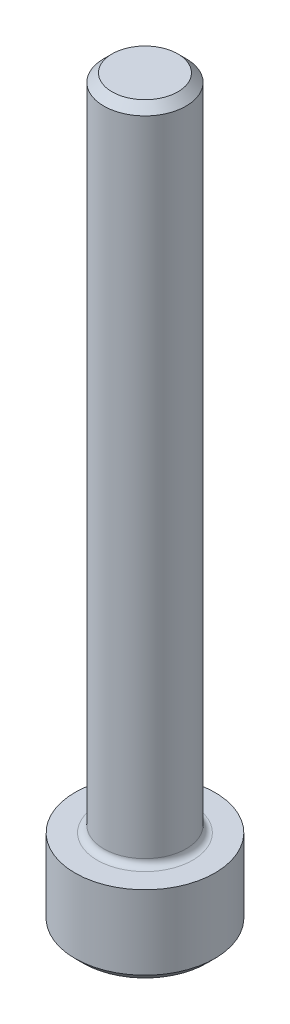
ISO-10303-21;
HEADER;
FILE_DESCRIPTION(('STEP AP214'),'2;1');
FILE_NAME('part.step','',(''),(''),'','','');
FILE_SCHEMA(('AUTOMOTIVE_DESIGN { 1 0 10303 214 1 1 1 1 }'));
ENDSEC;
DATA;
#1=APPLICATION_CONTEXT('core data for automotive mechanical design processes');
#2=APPLICATION_PROTOCOL_DEFINITION('international standard','automotive_design',2000,#1);
#3=PRODUCT_CONTEXT('',#1,'mechanical');
#4=PRODUCT('Part','Part','',(#3));
#5=PRODUCT_RELATED_PRODUCT_CATEGORY('part','',(#4));
#6=PRODUCT_DEFINITION_FORMATION('','',#4);
#7=PRODUCT_DEFINITION_CONTEXT('part definition',#1,'design');
#8=PRODUCT_DEFINITION('design','',#6,#7);
#9=PRODUCT_DEFINITION_SHAPE('','',#8);
#10=(LENGTH_UNIT() NAMED_UNIT(*) SI_UNIT(.MILLI.,.METRE.));
#11=(NAMED_UNIT(*) PLANE_ANGLE_UNIT() SI_UNIT($,.RADIAN.));
#12=(NAMED_UNIT(*) SI_UNIT($,.STERADIAN.) SOLID_ANGLE_UNIT());
#13=UNCERTAINTY_MEASURE_WITH_UNIT(LENGTH_MEASURE(1.E-05),#10,'distance_accuracy_value','');
#14=(GEOMETRIC_REPRESENTATION_CONTEXT(3) GLOBAL_UNCERTAINTY_ASSIGNED_CONTEXT((#13)) GLOBAL_UNIT_ASSIGNED_CONTEXT((#10,
#11,#12)) REPRESENTATION_CONTEXT('',''));
#15=CARTESIAN_POINT('',(0.,0.,0.));
#16=DIRECTION('',(0.,0.,1.));
#17=DIRECTION('',(1.,0.,0.));
#18=AXIS2_PLACEMENT_3D('',#15,#16,#17);
#19=CARTESIAN_POINT('',(0.,40.,0.));
#20=DIRECTION('',(0.,-1.,0.));
#21=DIRECTION('',(0.,0.,-1.));
#22=AXIS2_PLACEMENT_3D('',#19,#20,#21);
#23=CYLINDRICAL_SURFACE('',#22,2.5);
#24=CARTESIAN_POINT('',(0.,39.5,0.));
#25=DIRECTION('',(0.,1.,0.));
#26=DIRECTION('',(0.,0.,1.));
#27=AXIS2_PLACEMENT_3D('',#24,#25,#26);
#28=CIRCLE('',#27,2.5);
#29=CARTESIAN_POINT('',(0.,39.5,2.5));
#30=VERTEX_POINT('',#29);
#31=EDGE_CURVE('E11',#30,#30,#28,.F.);
#32=ORIENTED_EDGE('',*,*,#31,.T.);
#33=EDGE_LOOP('',(#32));
#34=FACE_BOUND('',#33,.T.);
#35=CARTESIAN_POINT('',(0.,0.399999999999998,0.));
#36=DIRECTION('',(0.,1.,0.));
#37=DIRECTION('',(0.,0.,1.));
#38=AXIS2_PLACEMENT_3D('',#35,#36,#37);
#39=CIRCLE('',#38,2.5);
#40=CARTESIAN_POINT('',(0.,0.399999999999998,2.5));
#41=VERTEX_POINT('',#40);
#42=EDGE_CURVE('E145',#41,#41,#39,.T.);
#43=ORIENTED_EDGE('',*,*,#42,.T.);
#44=EDGE_LOOP('',(#43));
#45=FACE_BOUND('',#44,.T.);
#46=ADVANCED_FACE('F35',(#34,#45),#23,.T.);
#47=CARTESIAN_POINT('',(0.,40.,0.));
#48=DIRECTION('',(0.,1.,0.));
#49=DIRECTION('',(0.,0.,1.));
#50=AXIS2_PLACEMENT_3D('',#47,#48,#49);
#51=PLANE('',#50);
#52=CARTESIAN_POINT('',(0.,40.,0.));
#53=DIRECTION('',(0.,1.,0.));
#54=DIRECTION('',(0.,0.,1.));
#55=AXIS2_PLACEMENT_3D('',#52,#53,#54);
#56=CIRCLE('',#55,2.00000000000001);
#57=CARTESIAN_POINT('',(0.,40.,2.00000000000001));
#58=VERTEX_POINT('',#57);
#59=EDGE_CURVE('E43',#58,#58,#56,.T.);
#60=ORIENTED_EDGE('',*,*,#59,.T.);
#61=EDGE_LOOP('',(#60));
#62=FACE_BOUND('',#61,.T.);
#63=ADVANCED_FACE('F159',(#62),#51,.T.);
#64=CARTESIAN_POINT('',(0.,-5.,0.));
#65=DIRECTION('',(0.,1.,0.));
#66=DIRECTION('',(0.,0.,1.));
#67=AXIS2_PLACEMENT_3D('',#64,#65,#66);
#68=CYLINDRICAL_SURFACE('',#67,4.25);
#69=CARTESIAN_POINT('',(0.,-4.5,0.));
#70=DIRECTION('',(0.,1.,0.));
#71=DIRECTION('',(0.,0.,1.));
#72=AXIS2_PLACEMENT_3D('',#69,#70,#71);
#73=CIRCLE('',#72,4.25);
#74=CARTESIAN_POINT('',(0.,-4.5,4.25));
#75=VERTEX_POINT('',#74);
#76=EDGE_CURVE('E151',#75,#75,#73,.T.);
#77=ORIENTED_EDGE('',*,*,#76,.T.);
#78=EDGE_LOOP('',(#77));
#79=FACE_BOUND('',#78,.T.);
#80=CARTESIAN_POINT('',(0.,0.,0.));
#81=DIRECTION('',(0.,1.,0.));
#82=DIRECTION('',(0.,0.,1.));
#83=AXIS2_PLACEMENT_3D('',#80,#81,#82);
#84=CIRCLE('',#83,4.25);
#85=CARTESIAN_POINT('',(0.,0.,4.25));
#86=VERTEX_POINT('',#85);
#87=EDGE_CURVE('E137',#86,#86,#84,.T.);
#88=ORIENTED_EDGE('',*,*,#87,.F.);
#89=EDGE_LOOP('',(#88));
#90=FACE_BOUND('',#89,.T.);
#91=ADVANCED_FACE('F180',(#79,#90),#68,.T.);
#92=CARTESIAN_POINT('',(0.,-5.,0.));
#93=DIRECTION('',(0.,1.,0.));
#94=DIRECTION('',(0.,0.,1.));
#95=AXIS2_PLACEMENT_3D('',#92,#93,#94);
#96=PLANE('',#95);
#97=DIRECTION('',(-0.866025403784439,0.,-0.5));
#98=VECTOR('',#97,1.);
#99=CARTESIAN_POINT('',(0.,-5.,2.3094010767585));
#100=LINE('',#99,#98);
#101=CARTESIAN_POINT('',(0.,-5.,2.3094010767585));
#102=VERTEX_POINT('',#101);
#103=CARTESIAN_POINT('',(-2.,-5.,1.15470053837925));
#104=VERTEX_POINT('',#103);
#105=EDGE_CURVE('E124',#102,#104,#100,.T.);
#106=ORIENTED_EDGE('',*,*,#105,.F.);
#107=DIRECTION('',(-0.866025403784439,0.,0.5));
#108=VECTOR('',#107,1.);
#109=CARTESIAN_POINT('',(2.,-5.,1.15470053837925));
#110=LINE('',#109,#108);
#111=CARTESIAN_POINT('',(2.,-5.,1.15470053837925));
#112=VERTEX_POINT('',#111);
#113=EDGE_CURVE('E50',#112,#102,#110,.T.);
#114=ORIENTED_EDGE('',*,*,#113,.F.);
#115=DIRECTION('',(0.,0.,1.));
#116=VECTOR('',#115,1.);
#117=CARTESIAN_POINT('',(2.,-5.,-1.15470053837925));
#118=LINE('',#117,#116);
#119=CARTESIAN_POINT('',(2.,-5.,-1.15470053837925));
#120=VERTEX_POINT('',#119);
#121=EDGE_CURVE('E133',#120,#112,#118,.T.);
#122=ORIENTED_EDGE('',*,*,#121,.F.);
#123=DIRECTION('',(0.866025403784439,0.,0.5));
#124=VECTOR('',#123,1.);
#125=CARTESIAN_POINT('',(0.,-5.,-2.3094010767585));
#126=LINE('',#125,#124);
#127=CARTESIAN_POINT('',(0.,-5.,-2.3094010767585));
#128=VERTEX_POINT('',#127);
#129=EDGE_CURVE('E131',#128,#120,#126,.T.);
#130=ORIENTED_EDGE('',*,*,#129,.F.);
#131=DIRECTION('',(0.866025403784439,0.,-0.5));
#132=VECTOR('',#131,1.);
#133=CARTESIAN_POINT('',(-2.,-5.,-1.15470053837925));
#134=LINE('',#133,#132);
#135=CARTESIAN_POINT('',(-2.,-5.,-1.15470053837925));
#136=VERTEX_POINT('',#135);
#137=EDGE_CURVE('E98',#136,#128,#134,.T.);
#138=ORIENTED_EDGE('',*,*,#137,.F.);
#139=DIRECTION('',(0.,0.,-1.));
#140=VECTOR('',#139,1.);
#141=CARTESIAN_POINT('',(-2.,-5.,1.15470053837925));
#142=LINE('',#141,#140);
#143=EDGE_CURVE('E127',#104,#136,#142,.T.);
#144=ORIENTED_EDGE('',*,*,#143,.F.);
#145=EDGE_LOOP('',(#106,#114,#122,#130,#138,#144));
#146=FACE_BOUND('',#145,.T.);
#147=CARTESIAN_POINT('',(0.,-5.,0.));
#148=DIRECTION('',(0.,1.,0.));
#149=DIRECTION('',(0.,0.,1.));
#150=AXIS2_PLACEMENT_3D('',#147,#148,#149);
#151=CIRCLE('',#150,3.75);
#152=CARTESIAN_POINT('',(0.,-5.,3.75));
#153=VERTEX_POINT('',#152);
#154=EDGE_CURVE('E154',#153,#153,#151,.F.);
#155=ORIENTED_EDGE('',*,*,#154,.T.);
#156=EDGE_LOOP('',(#155));
#157=FACE_BOUND('',#156,.T.);
#158=ADVANCED_FACE('F191',(#146,#157),#96,.F.);
#159=CARTESIAN_POINT('',(0.,0.,0.));
#160=DIRECTION('',(0.,1.,0.));
#161=DIRECTION('',(0.,0.,1.));
#162=AXIS2_PLACEMENT_3D('',#159,#160,#161);
#163=PLANE('',#162);
#164=CARTESIAN_POINT('',(0.,0.,0.));
#165=DIRECTION('',(0.,1.,0.));
#166=DIRECTION('',(0.,0.,1.));
#167=AXIS2_PLACEMENT_3D('',#164,#165,#166);
#168=CIRCLE('',#167,2.9);
#169=CARTESIAN_POINT('',(0.,0.,2.9));
#170=VERTEX_POINT('',#169);
#171=EDGE_CURVE('E148',#170,#170,#168,.F.);
#172=ORIENTED_EDGE('',*,*,#171,.T.);
#173=EDGE_LOOP('',(#172));
#174=FACE_BOUND('',#173,.T.);
#175=ORIENTED_EDGE('',*,*,#87,.T.);
#176=EDGE_LOOP('',(#175));
#177=FACE_BOUND('',#176,.T.);
#178=ADVANCED_FACE('F186',(#174,#177),#163,.T.);
#179=CARTESIAN_POINT('',(0.,0.399999999999998,0.));
#180=DIRECTION('',(0.,1.,0.));
#181=DIRECTION('',(0.,0.,1.));
#182=AXIS2_PLACEMENT_3D('',#179,#180,#181);
#183=TOROIDAL_SURFACE('',#182,2.9,0.4);
#184=ORIENTED_EDGE('',*,*,#171,.F.);
#185=EDGE_LOOP('',(#184));
#186=FACE_BOUND('',#185,.T.);
#187=ORIENTED_EDGE('',*,*,#42,.F.);
#188=EDGE_LOOP('',(#187));
#189=FACE_BOUND('',#188,.T.);
#190=ADVANCED_FACE('F171',(#186,#189),#183,.F.);
#191=CARTESIAN_POINT('',(0.,-4.5,0.));
#192=DIRECTION('',(0.,1.,0.));
#193=DIRECTION('',(0.,0.,1.));
#194=AXIS2_PLACEMENT_3D('',#191,#192,#193);
#195=CONICAL_SURFACE('',#194,4.25,0.785398163397453);
#196=ORIENTED_EDGE('',*,*,#154,.F.);
#197=EDGE_LOOP('',(#196));
#198=FACE_BOUND('',#197,.T.);
#199=ORIENTED_EDGE('',*,*,#76,.F.);
#200=EDGE_LOOP('',(#199));
#201=FACE_BOUND('',#200,.T.);
#202=ADVANCED_FACE('F163',(#198,#201),#195,.T.);
#203=CARTESIAN_POINT('',(0.,40.,0.));
#204=DIRECTION('',(0.,-1.,0.));
#205=DIRECTION('',(0.,0.,-1.));
#206=AXIS2_PLACEMENT_3D('',#203,#204,#205);
#207=CONICAL_SURFACE('',#206,2.00000000000001,0.78539816339744);
#208=ORIENTED_EDGE('',*,*,#31,.F.);
#209=EDGE_LOOP('',(#208));
#210=FACE_BOUND('',#209,.T.);
#211=ORIENTED_EDGE('',*,*,#59,.F.);
#212=EDGE_LOOP('',(#211));
#213=FACE_BOUND('',#212,.T.);
#214=ADVANCED_FACE('F37',(#210,#213),#207,.T.);
#215=CARTESIAN_POINT('',(2.,-2.5,1.15470053837925));
#216=DIRECTION('',(0.5,0.,0.866025403784439));
#217=DIRECTION('',(0.866025403784439,0.,-0.5));
#218=AXIS2_PLACEMENT_3D('',#215,#216,#217);
#219=PLANE('',#218);
#220=ORIENTED_EDGE('',*,*,#113,.T.);
#221=DIRECTION('',(0.,-1.,0.));
#222=VECTOR('',#221,1.);
#223=CARTESIAN_POINT('',(0.,-2.5,2.3094010767585));
#224=LINE('',#223,#222);
#225=CARTESIAN_POINT('',(0.,-2.5,2.3094010767585));
#226=VERTEX_POINT('',#225);
#227=EDGE_CURVE('E80',#226,#102,#224,.T.);
#228=ORIENTED_EDGE('',*,*,#227,.F.);
#229=DIRECTION('',(-0.866025403784439,0.,0.5));
#230=VECTOR('',#229,1.);
#231=CARTESIAN_POINT('',(2.,-2.5,1.15470053837925));
#232=LINE('',#231,#230);
#233=CARTESIAN_POINT('',(2.,-2.5,1.15470053837925));
#234=VERTEX_POINT('',#233);
#235=EDGE_CURVE('E135',#234,#226,#232,.T.);
#236=ORIENTED_EDGE('',*,*,#235,.F.);
#237=DIRECTION('',(0.,-1.,0.));
#238=VECTOR('',#237,1.);
#239=CARTESIAN_POINT('',(2.,-2.5,1.15470053837925));
#240=LINE('',#239,#238);
#241=EDGE_CURVE('E58',#234,#112,#240,.T.);
#242=ORIENTED_EDGE('',*,*,#241,.T.);
#243=EDGE_LOOP('',(#220,#228,#236,#242));
#244=FACE_BOUND('',#243,.T.);
#245=ADVANCED_FACE('F162',(#244),#219,.F.);
#246=CARTESIAN_POINT('',(2.,-2.5,-1.15470053837925));
#247=DIRECTION('',(1.,0.,0.));
#248=DIRECTION('',(0.,0.,-1.));
#249=AXIS2_PLACEMENT_3D('',#246,#247,#248);
#250=PLANE('',#249);
#251=ORIENTED_EDGE('',*,*,#121,.T.);
#252=ORIENTED_EDGE('',*,*,#241,.F.);
#253=DIRECTION('',(0.,0.,1.));
#254=VECTOR('',#253,1.);
#255=CARTESIAN_POINT('',(2.,-2.5,-1.15470053837925));
#256=LINE('',#255,#254);
#257=CARTESIAN_POINT('',(2.,-2.5,-1.15470053837925));
#258=VERTEX_POINT('',#257);
#259=EDGE_CURVE('E110',#258,#234,#256,.T.);
#260=ORIENTED_EDGE('',*,*,#259,.F.);
#261=DIRECTION('',(0.,-1.,0.));
#262=VECTOR('',#261,1.);
#263=CARTESIAN_POINT('',(2.,-2.5,-1.15470053837925));
#264=LINE('',#263,#262);
#265=EDGE_CURVE('E102',#258,#120,#264,.T.);
#266=ORIENTED_EDGE('',*,*,#265,.T.);
#267=EDGE_LOOP('',(#251,#252,#260,#266));
#268=FACE_BOUND('',#267,.T.);
#269=ADVANCED_FACE('F169',(#268),#250,.F.);
#270=CARTESIAN_POINT('',(0.,-2.5,-2.3094010767585));
#271=DIRECTION('',(0.5,0.,-0.866025403784439));
#272=DIRECTION('',(-0.866025403784439,0.,-0.5));
#273=AXIS2_PLACEMENT_3D('',#270,#271,#272);
#274=PLANE('',#273);
#275=ORIENTED_EDGE('',*,*,#129,.T.);
#276=ORIENTED_EDGE('',*,*,#265,.F.);
#277=DIRECTION('',(0.866025403784439,0.,0.5));
#278=VECTOR('',#277,1.);
#279=CARTESIAN_POINT('',(0.,-2.5,-2.3094010767585));
#280=LINE('',#279,#278);
#281=CARTESIAN_POINT('',(0.,-2.5,-2.3094010767585));
#282=VERTEX_POINT('',#281);
#283=EDGE_CURVE('E106',#282,#258,#280,.T.);
#284=ORIENTED_EDGE('',*,*,#283,.F.);
#285=DIRECTION('',(0.,-1.,0.));
#286=VECTOR('',#285,1.);
#287=CARTESIAN_POINT('',(0.,-2.5,-2.3094010767585));
#288=LINE('',#287,#286);
#289=EDGE_CURVE('E91',#282,#128,#288,.T.);
#290=ORIENTED_EDGE('',*,*,#289,.T.);
#291=EDGE_LOOP('',(#275,#276,#284,#290));
#292=FACE_BOUND('',#291,.T.);
#293=ADVANCED_FACE('F107',(#292),#274,.F.);
#294=CARTESIAN_POINT('',(-2.,-2.5,-1.15470053837925));
#295=DIRECTION('',(-0.5,0.,-0.866025403784439));
#296=DIRECTION('',(-0.866025403784439,0.,0.5));
#297=AXIS2_PLACEMENT_3D('',#294,#295,#296);
#298=PLANE('',#297);
#299=ORIENTED_EDGE('',*,*,#137,.T.);
#300=ORIENTED_EDGE('',*,*,#289,.F.);
#301=DIRECTION('',(0.866025403784439,0.,-0.5));
#302=VECTOR('',#301,1.);
#303=CARTESIAN_POINT('',(-2.,-2.5,-1.15470053837925));
#304=LINE('',#303,#302);
#305=CARTESIAN_POINT('',(-2.,-2.5,-1.15470053837925));
#306=VERTEX_POINT('',#305);
#307=EDGE_CURVE('E95',#306,#282,#304,.T.);
#308=ORIENTED_EDGE('',*,*,#307,.F.);
#309=DIRECTION('',(0.,-1.,0.));
#310=VECTOR('',#309,1.);
#311=CARTESIAN_POINT('',(-2.,-2.5,-1.15470053837925));
#312=LINE('',#311,#310);
#313=EDGE_CURVE('E103',#306,#136,#312,.T.);
#314=ORIENTED_EDGE('',*,*,#313,.T.);
#315=EDGE_LOOP('',(#299,#300,#308,#314));
#316=FACE_BOUND('',#315,.T.);
#317=ADVANCED_FACE('F93',(#316),#298,.F.);
#318=CARTESIAN_POINT('',(-2.,-2.5,1.15470053837925));
#319=DIRECTION('',(-1.,0.,0.));
#320=DIRECTION('',(0.,0.,1.));
#321=AXIS2_PLACEMENT_3D('',#318,#319,#320);
#322=PLANE('',#321);
#323=ORIENTED_EDGE('',*,*,#143,.T.);
#324=ORIENTED_EDGE('',*,*,#313,.F.);
#325=DIRECTION('',(0.,0.,-1.));
#326=VECTOR('',#325,1.);
#327=CARTESIAN_POINT('',(-2.,-2.5,1.15470053837925));
#328=LINE('',#327,#326);
#329=CARTESIAN_POINT('',(-2.,-2.5,1.15470053837925));
#330=VERTEX_POINT('',#329);
#331=EDGE_CURVE('E116',#330,#306,#328,.T.);
#332=ORIENTED_EDGE('',*,*,#331,.F.);
#333=DIRECTION('',(0.,-1.,0.));
#334=VECTOR('',#333,1.);
#335=CARTESIAN_POINT('',(-2.,-2.5,1.15470053837925));
#336=LINE('',#335,#334);
#337=EDGE_CURVE('E140',#330,#104,#336,.T.);
#338=ORIENTED_EDGE('',*,*,#337,.T.);
#339=EDGE_LOOP('',(#323,#324,#332,#338));
#340=FACE_BOUND('',#339,.T.);
#341=ADVANCED_FACE('F211',(#340),#322,.F.);
#342=CARTESIAN_POINT('',(0.,-2.5,2.3094010767585));
#343=DIRECTION('',(-0.5,0.,0.866025403784439));
#344=DIRECTION('',(0.866025403784439,0.,0.5));
#345=AXIS2_PLACEMENT_3D('',#342,#343,#344);
#346=PLANE('',#345);
#347=ORIENTED_EDGE('',*,*,#105,.T.);
#348=ORIENTED_EDGE('',*,*,#337,.F.);
#349=DIRECTION('',(-0.866025403784439,0.,-0.5));
#350=VECTOR('',#349,1.);
#351=CARTESIAN_POINT('',(0.,-2.5,2.3094010767585));
#352=LINE('',#351,#350);
#353=EDGE_CURVE('E118',#226,#330,#352,.T.);
#354=ORIENTED_EDGE('',*,*,#353,.F.);
#355=ORIENTED_EDGE('',*,*,#227,.T.);
#356=EDGE_LOOP('',(#347,#348,#354,#355));
#357=FACE_BOUND('',#356,.T.);
#358=ADVANCED_FACE('F208',(#357),#346,.F.);
#359=CARTESIAN_POINT('',(0.,-2.5,0.));
#360=DIRECTION('',(0.,-1.,0.));
#361=DIRECTION('',(0.,0.,-1.));
#362=AXIS2_PLACEMENT_3D('',#359,#360,#361);
#363=PLANE('',#362);
#364=ORIENTED_EDGE('',*,*,#235,.T.);
#365=ORIENTED_EDGE('',*,*,#353,.T.);
#366=ORIENTED_EDGE('',*,*,#331,.T.);
#367=ORIENTED_EDGE('',*,*,#307,.T.);
#368=ORIENTED_EDGE('',*,*,#283,.T.);
#369=ORIENTED_EDGE('',*,*,#259,.T.);
#370=EDGE_LOOP('',(#364,#365,#366,#367,#368,#369));
#371=FACE_BOUND('',#370,.T.);
#372=ADVANCED_FACE('F113',(#371),#363,.T.);
#373=CLOSED_SHELL('',(#46,#63,#91,#158,#178,#190,#202,#214,#245,#269,#293,#317,#341,#358,#372));
#374=MANIFOLD_SOLID_BREP('B2',#373);
#375=ADVANCED_BREP_SHAPE_REPRESENTATION('',(#18,#374),#14);
#376=SHAPE_DEFINITION_REPRESENTATION(#9,#375);
ENDSEC;
END-ISO-10303-21;
